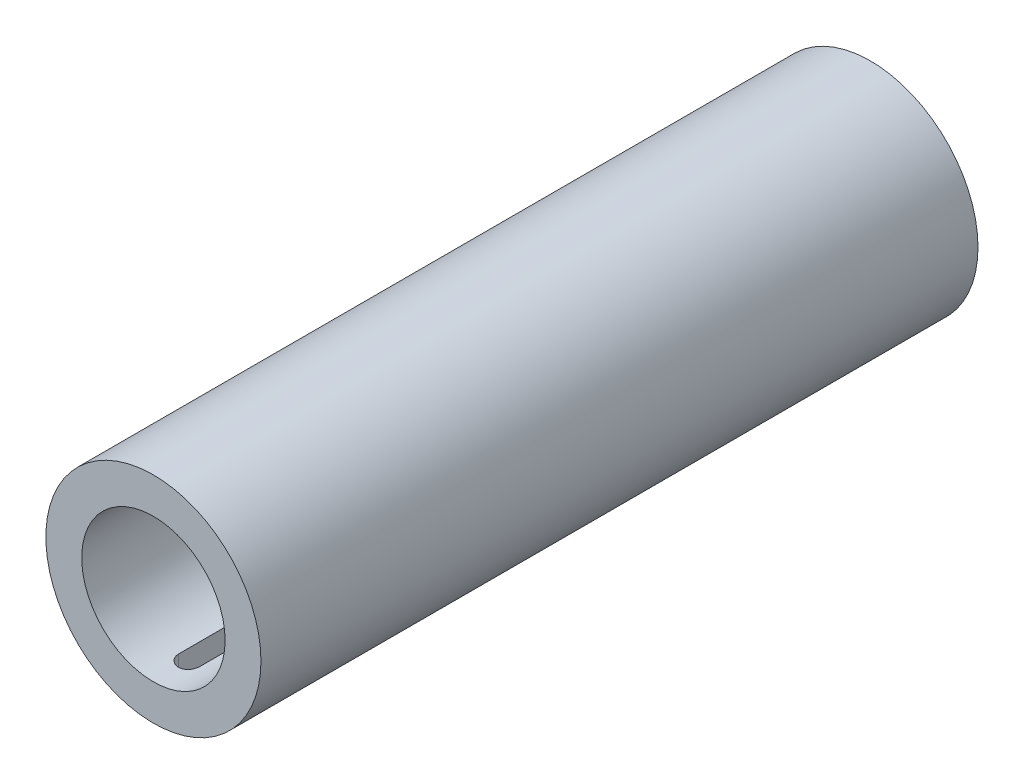
ISO-10303-21;
HEADER;
FILE_DESCRIPTION(('STEP AP214'),'2;1');
FILE_NAME('part.step','',(''),(''),'','','');
FILE_SCHEMA(('AUTOMOTIVE_DESIGN { 1 0 10303 214 1 1 1 1 }'));
ENDSEC;
DATA;
#1=APPLICATION_CONTEXT('core data for automotive mechanical design processes');
#2=APPLICATION_PROTOCOL_DEFINITION('international standard','automotive_design',2000,#1);
#3=PRODUCT_CONTEXT('',#1,'mechanical');
#4=PRODUCT('Part','Part','',(#3));
#5=PRODUCT_RELATED_PRODUCT_CATEGORY('part','',(#4));
#6=PRODUCT_DEFINITION_FORMATION('','',#4);
#7=PRODUCT_DEFINITION_CONTEXT('part definition',#1,'design');
#8=PRODUCT_DEFINITION('design','',#6,#7);
#9=PRODUCT_DEFINITION_SHAPE('','',#8);
#10=(LENGTH_UNIT() NAMED_UNIT(*) SI_UNIT(.MILLI.,.METRE.));
#11=(NAMED_UNIT(*) PLANE_ANGLE_UNIT() SI_UNIT($,.RADIAN.));
#12=(NAMED_UNIT(*) SI_UNIT($,.STERADIAN.) SOLID_ANGLE_UNIT());
#13=UNCERTAINTY_MEASURE_WITH_UNIT(LENGTH_MEASURE(1.E-05),#10,'distance_accuracy_value','');
#14=(GEOMETRIC_REPRESENTATION_CONTEXT(3) GLOBAL_UNCERTAINTY_ASSIGNED_CONTEXT((#13)) GLOBAL_UNIT_ASSIGNED_CONTEXT((#10,
#11,#12)) REPRESENTATION_CONTEXT('',''));
#15=CARTESIAN_POINT('',(0.,0.,0.));
#16=DIRECTION('',(0.,0.,1.));
#17=DIRECTION('',(1.,0.,0.));
#18=AXIS2_PLACEMENT_3D('',#15,#16,#17);
#19=CARTESIAN_POINT('',(0.,0.,100.));
#20=DIRECTION('',(0.,0.,1.));
#21=DIRECTION('',(1.,0.,0.));
#22=AXIS2_PLACEMENT_3D('',#19,#20,#21);
#23=PLANE('',#22);
#24=CARTESIAN_POINT('',(0.,0.,100.));
#25=DIRECTION('',(0.,0.,1.));
#26=DIRECTION('',(1.,0.,0.));
#27=AXIS2_PLACEMENT_3D('',#24,#25,#26);
#28=CIRCLE('',#27,15.);
#29=CARTESIAN_POINT('',(15.,0.,100.));
#30=VERTEX_POINT('',#29);
#31=EDGE_CURVE('E192',#30,#30,#28,.T.);
#32=ORIENTED_EDGE('',*,*,#31,.T.);
#33=EDGE_LOOP('',(#32));
#34=FACE_BOUND('',#33,.T.);
#35=CARTESIAN_POINT('',(0.,0.,100.));
#36=DIRECTION('',(0.,0.,1.));
#37=DIRECTION('',(1.,0.,0.));
#38=AXIS2_PLACEMENT_3D('',#35,#36,#37);
#39=CIRCLE('',#38,10.);
#40=CARTESIAN_POINT('',(10.,0.,100.));
#41=VERTEX_POINT('',#40);
#42=EDGE_CURVE('E183',#41,#41,#39,.T.);
#43=ORIENTED_EDGE('',*,*,#42,.F.);
#44=EDGE_LOOP('',(#43));
#45=FACE_BOUND('',#44,.T.);
#46=ADVANCED_FACE('F41',(#34,#45),#23,.T.);
#47=CARTESIAN_POINT('',(0.,0.,0.));
#48=DIRECTION('',(0.,0.,1.));
#49=DIRECTION('',(1.,0.,0.));
#50=AXIS2_PLACEMENT_3D('',#47,#48,#49);
#51=PLANE('',#50);
#52=DIRECTION('',(1.,0.,0.));
#53=VECTOR('',#52,1.);
#54=CARTESIAN_POINT('',(1.57769424203311,-11.,0.));
#55=LINE('',#54,#53);
#56=CARTESIAN_POINT('',(-1.57769424203311,-11.,0.));
#57=VERTEX_POINT('',#56);
#58=CARTESIAN_POINT('',(1.57769424203311,-11.,0.));
#59=VERTEX_POINT('',#58);
#60=EDGE_CURVE('E174',#57,#59,#55,.T.);
#61=ORIENTED_EDGE('',*,*,#60,.F.);
#62=DIRECTION('',(-0.5,0.866025403784439,0.));
#63=VECTOR('',#62,1.);
#64=CARTESIAN_POINT('',(-1.57769424203311,-11.,0.));
#65=LINE('',#64,#63);
#66=CARTESIAN_POINT('',(0.,-13.7326465860102,0.));
#67=VERTEX_POINT('',#66);
#68=EDGE_CURVE('E114',#67,#57,#65,.T.);
#69=ORIENTED_EDGE('',*,*,#68,.F.);
#70=DIRECTION('',(-0.5,-0.866025403784439,0.));
#71=VECTOR('',#70,1.);
#72=CARTESIAN_POINT('',(0.,-13.7326465860102,0.));
#73=LINE('',#72,#71);
#74=EDGE_CURVE('E226',#59,#67,#73,.T.);
#75=ORIENTED_EDGE('',*,*,#74,.F.);
#76=EDGE_LOOP('',(#61,#69,#75));
#77=FACE_BOUND('',#76,.T.);
#78=CARTESIAN_POINT('',(0.,0.,0.));
#79=DIRECTION('',(0.,0.,1.));
#80=DIRECTION('',(1.,0.,0.));
#81=AXIS2_PLACEMENT_3D('',#78,#79,#80);
#82=CIRCLE('',#81,15.);
#83=CARTESIAN_POINT('',(15.,0.,0.));
#84=VERTEX_POINT('',#83);
#85=EDGE_CURVE('E178',#84,#84,#82,.T.);
#86=ORIENTED_EDGE('',*,*,#85,.F.);
#87=EDGE_LOOP('',(#86));
#88=FACE_BOUND('',#87,.T.);
#89=CARTESIAN_POINT('',(0.,0.,0.));
#90=DIRECTION('',(0.,0.,1.));
#91=DIRECTION('',(1.,0.,0.));
#92=AXIS2_PLACEMENT_3D('',#89,#90,#91);
#93=CIRCLE('',#92,10.);
#94=CARTESIAN_POINT('',(10.,0.,0.));
#95=VERTEX_POINT('',#94);
#96=EDGE_CURVE('E181',#95,#95,#93,.T.);
#97=ORIENTED_EDGE('',*,*,#96,.T.);
#98=EDGE_LOOP('',(#97));
#99=FACE_BOUND('',#98,.T.);
#100=ADVANCED_FACE('F161',(#77,#88,#99),#51,.F.);
#101=CARTESIAN_POINT('',(0.,0.,100.));
#102=DIRECTION('',(0.,0.,-1.));
#103=DIRECTION('',(-1.,0.,0.));
#104=AXIS2_PLACEMENT_3D('',#101,#102,#103);
#105=CYLINDRICAL_SURFACE('',#104,15.);
#106=DIRECTION('',(0.,0.,-1.));
#107=VECTOR('',#106,1.);
#108=CARTESIAN_POINT('',(-1.5,-14.9248115565993,100.));
#109=LINE('',#108,#107);
#110=CARTESIAN_POINT('',(-1.5,-14.9248115565993,20.));
#111=VERTEX_POINT('',#110);
#112=CARTESIAN_POINT('',(-1.5,-14.9248115565993,95.));
#113=VERTEX_POINT('',#112);
#114=EDGE_CURVE('E108',#111,#113,#109,.F.);
#115=ORIENTED_EDGE('',*,*,#114,.T.);
#116=CARTESIAN_POINT('',(-1.5,-14.9248115565993,95.));
#117=CARTESIAN_POINT('',(-1.49999984550738,-14.9248105405652,95.0420888520983));
#118=CARTESIAN_POINT('',(-1.49822741440047,-14.9249898231295,95.084157436979));
#119=CARTESIAN_POINT('',(-1.49115728926902,-14.9256982610156,95.1679915135174));
#120=CARTESIAN_POINT('',(-1.48585982951031,-14.9262273930872,95.2097570251304));
#121=CARTESIAN_POINT('',(-1.46473386877576,-14.9283210001532,95.3340642077011));
#122=CARTESIAN_POINT('',(-1.44367162502198,-14.9303917616669,95.4157699236219));
#123=CARTESIAN_POINT('',(-1.38819060592267,-14.9356517710427,95.5744605109782));
#124=CARTESIAN_POINT('',(-1.35376680096843,-14.9388414400445,95.65144359205));
#125=CARTESIAN_POINT('',(-1.27255023718886,-14.9459784325361,95.7985422065466));
#126=CARTESIAN_POINT('',(-1.22575896870337,-14.9499256647202,95.8686585660505));
#127=CARTESIAN_POINT('',(-1.12095989168653,-14.9581486725595,96.000274463546));
#128=CARTESIAN_POINT('',(-1.06291731381802,-14.962425441222,96.0617462444893));
#129=CARTESIAN_POINT('',(-0.937329794826621,-14.9708171412676,96.1741006877466));
#130=CARTESIAN_POINT('',(-0.869783409359444,-14.9749320479297,96.2249817376113));
#131=CARTESIAN_POINT('',(-0.726937376238593,-14.9825458619702,96.3147983242583));
#132=CARTESIAN_POINT('',(-0.651621939828397,-14.9860434741472,96.3537088687447));
#133=CARTESIAN_POINT('',(-0.495490096453528,-14.9920174034256,96.4183181831312));
#134=CARTESIAN_POINT('',(-0.414674155302865,-14.9944938068837,96.4440180702124));
#135=CARTESIAN_POINT('',(-0.250118182972205,-14.9981394760791,96.4813966400431));
#136=CARTESIAN_POINT('',(-0.166388844193089,-14.9993130891162,96.4931219644158));
#137=CARTESIAN_POINT('',(0.00185903992906527,-15.0002357398837,96.502362961854));
#138=CARTESIAN_POINT('',(0.0863775840874468,-14.9999847797523,96.4998786562459));
#139=CARTESIAN_POINT('',(0.253483476941733,-14.9980900673199,96.480808269245));
#140=CARTESIAN_POINT('',(0.336076660363391,-14.9964513089226,96.4642727495197));
#141=CARTESIAN_POINT('',(0.497309163588857,-14.99197092482,96.4176481495405));
#142=CARTESIAN_POINT('',(0.575948451814888,-14.9891292895097,96.3875589610595));
#143=CARTESIAN_POINT('',(0.727202160756062,-14.9825539885859,96.3146250637809));
#144=CARTESIAN_POINT('',(0.799805598266283,-14.9788187427939,96.271757725872));
#145=CARTESIAN_POINT('',(0.936803159978407,-14.9708755799474,96.1745026896983));
#146=CARTESIAN_POINT('',(1.00119740952327,-14.9666676701117,96.1201151673644));
#147=CARTESIAN_POINT('',(1.12024011579595,-14.9582300399733,96.0010880188028));
#148=CARTESIAN_POINT('',(1.17484602298743,-14.9540003029365,95.9364058350899));
#149=CARTESIAN_POINT('',(1.2724482975244,-14.9460122474671,95.7987456015797));
#150=CARTESIAN_POINT('',(1.31544113382606,-14.942254072602,95.725765038159));
#151=CARTESIAN_POINT('',(1.38859533887637,-14.9356338508136,95.5735373774721));
#152=CARTESIAN_POINT('',(1.41874636545733,-14.9327725266579,95.4942852901006));
#153=CARTESIAN_POINT('',(1.4652563657267,-14.9282811773481,95.3318674206297));
#154=CARTESIAN_POINT('',(1.48163620279748,-14.9266492899856,95.2487077610874));
#155=CARTESIAN_POINT('',(1.49394303375407,-14.9254191773912,95.1374716507815));
#156=CARTESIAN_POINT('',(1.49621552314765,-14.9251914639091,95.1100026005142));
#157=CARTESIAN_POINT('',(1.49924195609436,-14.9248878407684,95.0550261844969));
#158=CARTESIAN_POINT('',(1.49999843343703,-14.9248116778171,95.0275189597002));
#159=CARTESIAN_POINT('',(1.5,-14.9248115565993,95.));
#160=B_SPLINE_CURVE_WITH_KNOTS('',3,(#116,#117,#118,#119,#120,#121,#122,#123,#124,#125,#126,
#127,#128,#129,#130,#131,#132,#133,#134,#135,#136,#137,#138,#139,#140,#141,#142,#143,#144,#145,
#146,#147,#148,#149,#150,#151,#152,#153,#154,#155,#156,#157,#158,#159),.UNSPECIFIED.,.F.,.F.,(4,
2,2,2,2,2,2,2,2,2,2,2,2,2,2,2,2,2,2,2,2,4),(0.,0.126188669953261,0.252368954516711,
0.504275212197885,0.756276385475112,1.00824720521265,1.26100946118738,1.51381017236425,
1.76713515973781,2.02043872074009,2.27289446461177,2.52534982958904,2.77690059136096,
3.02845336182359,3.28045428641837,3.53245136284618,3.78551861392433,4.03866272565792,
4.29201032358889,4.54497340414717,4.62763460025912,4.7101575248208),.UNSPECIFIED.);
#161=CARTESIAN_POINT('',(1.5,-14.9248115565993,95.));
#162=VERTEX_POINT('',#161);
#163=EDGE_CURVE('E117',#113,#162,#160,.T.);
#164=ORIENTED_EDGE('',*,*,#163,.T.);
#165=DIRECTION('',(0.,0.,-1.));
#166=VECTOR('',#165,1.);
#167=CARTESIAN_POINT('',(1.5,-14.9248115565993,100.));
#168=LINE('',#167,#166);
#169=CARTESIAN_POINT('',(1.5,-14.9248115565993,20.));
#170=VERTEX_POINT('',#169);
#171=EDGE_CURVE('E110',#162,#170,#168,.T.);
#172=ORIENTED_EDGE('',*,*,#171,.T.);
#173=CARTESIAN_POINT('',(1.5,-14.9248115565993,20.));
#174=CARTESIAN_POINT('',(1.49999984550738,-14.9248105405652,19.9579111479017));
#175=CARTESIAN_POINT('',(1.49822741440047,-14.9249898231295,19.915842563021));
#176=CARTESIAN_POINT('',(1.49115728926902,-14.9256982610156,19.8320084864826));
#177=CARTESIAN_POINT('',(1.48585982951031,-14.9262273930872,19.7902429748696));
#178=CARTESIAN_POINT('',(1.46473386877575,-14.9283210001532,19.6659357922989));
#179=CARTESIAN_POINT('',(1.44367162502198,-14.9303917616669,19.5842300763781));
#180=CARTESIAN_POINT('',(1.38819060592266,-14.9356517710427,19.4255394890218));
#181=CARTESIAN_POINT('',(1.35376680096842,-14.9388414400445,19.34855640795));
#182=CARTESIAN_POINT('',(1.27255023718886,-14.9459784325361,19.2014577934534));
#183=CARTESIAN_POINT('',(1.22575896870337,-14.9499256647202,19.1313414339495));
#184=CARTESIAN_POINT('',(1.12095989168653,-14.9581486725595,18.999725536454));
#185=CARTESIAN_POINT('',(1.06291731381802,-14.962425441222,18.9382537555107));
#186=CARTESIAN_POINT('',(0.937329794826616,-14.9708171412676,18.8258993122534));
#187=CARTESIAN_POINT('',(0.869783409359437,-14.9749320479297,18.7750182623887));
#188=CARTESIAN_POINT('',(0.726937376238586,-14.9825458619702,18.6852016757417));
#189=CARTESIAN_POINT('',(0.651621939828393,-14.9860434741472,18.6462911312553));
#190=CARTESIAN_POINT('',(0.495490096453525,-14.9920174034256,18.5816818168688));
#191=CARTESIAN_POINT('',(0.41467415530286,-14.9944938068837,18.5559819297876));
#192=CARTESIAN_POINT('',(0.250118182972199,-14.9981394760791,18.5186033599569));
#193=CARTESIAN_POINT('',(0.166388844193084,-14.9993130891162,18.5068780355842));
#194=CARTESIAN_POINT('',(-0.00185903992907218,-15.0002357398837,18.497637038146));
#195=CARTESIAN_POINT('',(-0.0863775840874553,-14.9999847797523,18.5001213437541));
#196=CARTESIAN_POINT('',(-0.253483476941741,-14.9980900673199,18.519191730755));
#197=CARTESIAN_POINT('',(-0.336076660363396,-14.9964513089226,18.5357272504803));
#198=CARTESIAN_POINT('',(-0.497309163588862,-14.99197092482,18.5823518504595));
#199=CARTESIAN_POINT('',(-0.575948451814895,-14.9891292895097,18.6124410389405));
#200=CARTESIAN_POINT('',(-0.727202160756066,-14.9825539885859,18.6853749362191));
#201=CARTESIAN_POINT('',(-0.799805598266282,-14.9788187427939,18.728242274128));
#202=CARTESIAN_POINT('',(-0.936803159978405,-14.9708755799474,18.8254973103017));
#203=CARTESIAN_POINT('',(-1.00119740952327,-14.9666676701117,18.8798848326356));
#204=CARTESIAN_POINT('',(-1.12024011579595,-14.9582300399733,18.9989119811972));
#205=CARTESIAN_POINT('',(-1.17484602298743,-14.9540003029365,19.0635941649101));
#206=CARTESIAN_POINT('',(-1.2724482975244,-14.9460122474671,19.2012543984203));
#207=CARTESIAN_POINT('',(-1.31544113382607,-14.942254072602,19.274234961841));
#208=CARTESIAN_POINT('',(-1.38859533887637,-14.9356338508136,19.4264626225279));
#209=CARTESIAN_POINT('',(-1.41874636545733,-14.9327725266579,19.5057147098994));
#210=CARTESIAN_POINT('',(-1.4652563657267,-14.9282811773481,19.6681325793703));
#211=CARTESIAN_POINT('',(-1.48163620279749,-14.9266492899856,19.7512922389126));
#212=CARTESIAN_POINT('',(-1.49394303375407,-14.9254191773912,19.8625283492185));
#213=CARTESIAN_POINT('',(-1.49621552314766,-14.9251914639091,19.8899973994859));
#214=CARTESIAN_POINT('',(-1.49924195609436,-14.9248878407684,19.9449738155032));
#215=CARTESIAN_POINT('',(-1.49999843343703,-14.9248116778171,19.9724810402998));
#216=CARTESIAN_POINT('',(-1.5,-14.9248115565993,20.));
#217=B_SPLINE_CURVE_WITH_KNOTS('',3,(#173,#174,#175,#176,#177,#178,#179,#180,#181,#182,#183,
#184,#185,#186,#187,#188,#189,#190,#191,#192,#193,#194,#195,#196,#197,#198,#199,#200,#201,#202,
#203,#204,#205,#206,#207,#208,#209,#210,#211,#212,#213,#214,#215,#216),.UNSPECIFIED.,.F.,.F.,(4,
2,2,2,2,2,2,2,2,2,2,2,2,2,2,2,2,2,2,2,2,4),(0.,0.126188669953261,0.252368954516705,
0.504275212197892,0.756276385475121,1.00824720521265,1.26100946118738,1.51381017236425,
1.76713515973781,2.02043872074009,2.27289446461177,2.52534982958905,2.77690059136096,
3.02845336182359,3.28045428641837,3.53245136284618,3.78551861392433,4.03866272565792,
4.29201032358889,4.54497340414718,4.62763460025914,4.7101575248208),.UNSPECIFIED.);
#218=EDGE_CURVE('E106',#170,#111,#217,.T.);
#219=ORIENTED_EDGE('',*,*,#218,.T.);
#220=EDGE_LOOP('',(#115,#164,#172,#219));
#221=FACE_BOUND('',#220,.T.);
#222=ORIENTED_EDGE('',*,*,#31,.F.);
#223=EDGE_LOOP('',(#222));
#224=FACE_BOUND('',#223,.T.);
#225=ORIENTED_EDGE('',*,*,#85,.T.);
#226=EDGE_LOOP('',(#225));
#227=FACE_BOUND('',#226,.T.);
#228=ADVANCED_FACE('F43',(#221,#224,#227),#105,.T.);
#229=CARTESIAN_POINT('',(0.,0.,100.));
#230=DIRECTION('',(0.,0.,-1.));
#231=DIRECTION('',(-1.,0.,0.));
#232=AXIS2_PLACEMENT_3D('',#229,#230,#231);
#233=CYLINDRICAL_SURFACE('',#232,10.);
#234=CARTESIAN_POINT('',(1.5,-9.88685996664259,20.));
#235=CARTESIAN_POINT('',(1.50000000266732,-9.88685840785077,19.9580518202284));
#236=CARTESIAN_POINT('',(1.49823923973863,-9.88712727473813,19.9161239716696));
#237=CARTESIAN_POINT('',(1.49121669464497,-9.88818949187884,19.8325729919536));
#238=CARTESIAN_POINT('',(1.48595522764718,-9.88898279491733,19.7909498337063));
#239=CARTESIAN_POINT('',(1.46497881750098,-9.89212058297808,19.6670918819678));
#240=CARTESIAN_POINT('',(1.44407166865904,-9.89522307907874,19.5856941728406));
#241=CARTESIAN_POINT('',(1.38902615352525,-9.90309898933595,19.4276160400256));
#242=CARTESIAN_POINT('',(1.35488426140282,-9.90787284872281,19.3509368797062));
#243=CARTESIAN_POINT('',(1.27435597412008,-9.91855133175475,19.2043846840671));
#244=CARTESIAN_POINT('',(1.22796990236328,-9.92445592553278,19.1345114690497));
#245=CARTESIAN_POINT('',(1.12388153164428,-9.93678257695107,19.003018343427));
#246=CARTESIAN_POINT('',(1.06610171081972,-9.94320799119173,18.9414601330534));
#247=CARTESIAN_POINT('',(0.941026215278604,-9.95582307783248,18.8288678084724));
#248=CARTESIAN_POINT('',(0.873729088931482,-9.9620127140873,18.7778353026265));
#249=CARTESIAN_POINT('',(0.731134276552847,-9.97349364061962,18.6875219740596));
#250=CARTESIAN_POINT('',(0.655799848412228,-9.9787804905557,18.6482985520619));
#251=CARTESIAN_POINT('',(0.499524151714074,-9.98782228654626,18.5830869108457));
#252=CARTESIAN_POINT('',(0.418583504853573,-9.991577402144,18.5570972267437));
#253=CARTESIAN_POINT('',(0.254032109539508,-9.99710911461993,18.5192768330848));
#254=CARTESIAN_POINT('',(0.170445893373183,-9.99890031620178,18.5073415576171));
#255=CARTESIAN_POINT('',(0.00243723131435105,-10.0003524554738,18.4976440141637));
#256=CARTESIAN_POINT('',(-0.0819851880217103,-10.0000134606003,18.4998812975124));
#257=CARTESIAN_POINT('',(-0.248551967983507,-9.99725499253034,18.5183833632824));
#258=CARTESIAN_POINT('',(-0.330709184196646,-9.99485226193999,18.5345352628208));
#259=CARTESIAN_POINT('',(-0.491133297591266,-9.98825497732616,18.5802307890995));
#260=CARTESIAN_POINT('',(-0.56940011783708,-9.98406038788298,18.6097746805602));
#261=CARTESIAN_POINT('',(-0.720165267893389,-9.97432184229562,18.6815316823409));
#262=CARTESIAN_POINT('',(-0.79264052820752,-9.96877281518181,18.7237925463523));
#263=CARTESIAN_POINT('',(-0.929510459057297,-9.95694413507246,18.8197474036781));
#264=CARTESIAN_POINT('',(-0.993904915673111,-9.95066446274332,18.8734416995637));
#265=CARTESIAN_POINT('',(-1.11344594750422,-9.93800248160563,18.9913597147132));
#266=CARTESIAN_POINT('',(-1.16849664126589,-9.93161976829432,19.0556806240439));
#267=CARTESIAN_POINT('',(-1.26705366225889,-9.9195286802005,19.1927216143761));
#268=CARTESIAN_POINT('',(-1.31055664285508,-9.91382050116966,19.2654441214946));
#269=CARTESIAN_POINT('',(-1.38479611633514,-9.90372408744827,19.41733398012));
#270=CARTESIAN_POINT('',(-1.41551523132484,-9.89933765170366,19.4965099305947));
#271=CARTESIAN_POINT('',(-1.46314856731708,-9.89241049501753,19.6589222567288));
#272=CARTESIAN_POINT('',(-1.48008348376203,-9.88986700772656,19.7421523456687));
#273=CARTESIAN_POINT('',(-1.49326003326035,-9.88788045186338,19.8550006632408));
#274=CARTESIAN_POINT('',(-1.49578864223619,-9.88749808040955,19.8839672253027));
#275=CARTESIAN_POINT('',(-1.49915639690531,-9.88698811323233,19.9419516924164));
#276=CARTESIAN_POINT('',(-1.49999838230593,-9.88686008927622,19.9709694287001));
#277=CARTESIAN_POINT('',(-1.5,-9.88685996664259,20.));
#278=B_SPLINE_CURVE_WITH_KNOTS('',3,(#234,#235,#236,#237,#238,#239,#240,#241,#242,#243,#244,
#245,#246,#247,#248,#249,#250,#251,#252,#253,#254,#255,#256,#257,#258,#259,#260,#261,#262,#263,
#264,#265,#266,#267,#268,#269,#270,#271,#272,#273,#274,#275,#276,#277),.UNSPECIFIED.,.F.,.F.,(4,
2,2,2,2,2,2,2,2,2,2,2,2,2,2,2,2,2,2,2,2,4),(0.,0.125766490239527,0.251521659296977,
0.502515401757197,0.753576056756899,1.00463008119644,1.25745516590775,1.51031885453268,
1.76439250557207,2.01843802629312,2.27058124023081,2.52271647202458,2.77282530444896,
3.02293908100775,3.27400403904697,3.52507564202535,3.77858546479491,4.03216867706422,
4.28609548338277,4.53964033991603,4.62684087345504,4.7138944667809),.UNSPECIFIED.);
#279=CARTESIAN_POINT('',(1.5,-9.88685996664259,20.));
#280=VERTEX_POINT('',#279);
#281=CARTESIAN_POINT('',(-1.5,-9.88685996664259,20.));
#282=VERTEX_POINT('',#281);
#283=EDGE_CURVE('E11',#280,#282,#278,.T.);
#284=ORIENTED_EDGE('',*,*,#283,.F.);
#285=DIRECTION('',(0.,0.,-1.));
#286=VECTOR('',#285,1.);
#287=CARTESIAN_POINT('',(1.5,-9.88685996664259,100.));
#288=LINE('',#287,#286);
#289=CARTESIAN_POINT('',(1.5,-9.88685996664259,95.));
#290=VERTEX_POINT('',#289);
#291=EDGE_CURVE('E56',#290,#280,#288,.T.);
#292=ORIENTED_EDGE('',*,*,#291,.F.);
#293=CARTESIAN_POINT('',(-1.5,-9.88685996664259,95.));
#294=CARTESIAN_POINT('',(-1.50000000266732,-9.88685840785077,95.0419481797716));
#295=CARTESIAN_POINT('',(-1.49823923973863,-9.88712727473813,95.0838760283304));
#296=CARTESIAN_POINT('',(-1.49121669464497,-9.88818949187884,95.1674270080464));
#297=CARTESIAN_POINT('',(-1.48595522764718,-9.88898279491733,95.2090501662937));
#298=CARTESIAN_POINT('',(-1.46497881750098,-9.89212058297808,95.3329081180322));
#299=CARTESIAN_POINT('',(-1.44407166865905,-9.89522307907874,95.4143058271594));
#300=CARTESIAN_POINT('',(-1.38902615352525,-9.90309898933595,95.5723839599744));
#301=CARTESIAN_POINT('',(-1.35488426140282,-9.90787284872282,95.6490631202938));
#302=CARTESIAN_POINT('',(-1.27435597412008,-9.91855133175475,95.7956153159329));
#303=CARTESIAN_POINT('',(-1.22796990236328,-9.92445592553278,95.8654885309503));
#304=CARTESIAN_POINT('',(-1.12388153164428,-9.93678257695107,95.996981656573));
#305=CARTESIAN_POINT('',(-1.06610171081972,-9.94320799119173,96.0585398669466));
#306=CARTESIAN_POINT('',(-0.941026215278609,-9.95582307783248,96.1711321915276));
#307=CARTESIAN_POINT('',(-0.873729088931483,-9.9620127140873,96.2221646973735));
#308=CARTESIAN_POINT('',(-0.731134276552846,-9.97349364061962,96.3124780259404));
#309=CARTESIAN_POINT('',(-0.655799848412227,-9.9787804905557,96.3517014479381));
#310=CARTESIAN_POINT('',(-0.499524151714072,-9.98782228654626,96.4169130891543));
#311=CARTESIAN_POINT('',(-0.418583504853571,-9.991577402144,96.4429027732563));
#312=CARTESIAN_POINT('',(-0.254032109539506,-9.99710911461993,96.4807231669152));
#313=CARTESIAN_POINT('',(-0.170445893373181,-9.99890031620178,96.4926584423829));
#314=CARTESIAN_POINT('',(-0.00243723131434989,-10.0003524554738,96.5023559858364));
#315=CARTESIAN_POINT('',(0.0819851880217116,-10.0000134606003,96.5001187024876));
#316=CARTESIAN_POINT('',(0.248551967983509,-9.99725499253034,96.4816166367175));
#317=CARTESIAN_POINT('',(0.330709184196647,-9.99485226193999,96.4654647371792));
#318=CARTESIAN_POINT('',(0.491133297591267,-9.98825497732616,96.4197692109005));
#319=CARTESIAN_POINT('',(0.569400117837082,-9.98406038788298,96.3902253194398));
#320=CARTESIAN_POINT('',(0.720165267893391,-9.97432184229562,96.3184683176591));
#321=CARTESIAN_POINT('',(0.79264052820752,-9.96877281518181,96.2762074536477));
#322=CARTESIAN_POINT('',(0.929510459057296,-9.95694413507246,96.1802525963219));
#323=CARTESIAN_POINT('',(0.99390491567311,-9.95066446274332,96.1265583004363));
#324=CARTESIAN_POINT('',(1.11344594750422,-9.93800248160563,96.0086402852868));
#325=CARTESIAN_POINT('',(1.16849664126589,-9.93161976829432,95.9443193759561));
#326=CARTESIAN_POINT('',(1.26705366225889,-9.9195286802005,95.8072783856238));
#327=CARTESIAN_POINT('',(1.31055664285509,-9.91382050116966,95.7345558785054));
#328=CARTESIAN_POINT('',(1.38479611633514,-9.90372408744827,95.58266601988));
#329=CARTESIAN_POINT('',(1.41551523132483,-9.89933765170366,95.5034900694053));
#330=CARTESIAN_POINT('',(1.46314856731708,-9.89241049501753,95.3410777432712));
#331=CARTESIAN_POINT('',(1.48008348376203,-9.88986700772656,95.2578476543313));
#332=CARTESIAN_POINT('',(1.49326003326035,-9.88788045186338,95.1449993367592));
#333=CARTESIAN_POINT('',(1.49578864223618,-9.88749808040955,95.1160327746973));
#334=CARTESIAN_POINT('',(1.49915639690531,-9.88698811323233,95.0580483075836));
#335=CARTESIAN_POINT('',(1.49999838230593,-9.88686008927622,95.0290305712999));
#336=CARTESIAN_POINT('',(1.5,-9.88685996664259,95.));
#337=B_SPLINE_CURVE_WITH_KNOTS('',3,(#293,#294,#295,#296,#297,#298,#299,#300,#301,#302,#303,
#304,#305,#306,#307,#308,#309,#310,#311,#312,#313,#314,#315,#316,#317,#318,#319,#320,#321,#322,
#323,#324,#325,#326,#327,#328,#329,#330,#331,#332,#333,#334,#335,#336),.UNSPECIFIED.,.F.,.F.,(4,
2,2,2,2,2,2,2,2,2,2,2,2,2,2,2,2,2,2,2,2,4),(0.,0.125766490239516,0.251521659296963,
0.502515401757197,0.753576056756896,1.00463008119643,1.25745516590774,1.51031885453268,
1.76439250557207,2.01843802629312,2.27058124023081,2.52271647202459,2.77282530444897,
3.02293908100775,3.27400403904697,3.52507564202536,3.77858546479491,4.03216867706424,
4.28609548338274,4.53964033991602,4.62684087345504,4.71389446678091),.UNSPECIFIED.);
#338=CARTESIAN_POINT('',(-1.5,-9.88685996664259,95.));
#339=VERTEX_POINT('',#338);
#340=EDGE_CURVE('E143',#339,#290,#337,.T.);
#341=ORIENTED_EDGE('',*,*,#340,.F.);
#342=DIRECTION('',(0.,0.,-1.));
#343=VECTOR('',#342,1.);
#344=CARTESIAN_POINT('',(-1.5,-9.88685996664259,100.));
#345=LINE('',#344,#343);
#346=EDGE_CURVE('E149',#282,#339,#345,.F.);
#347=ORIENTED_EDGE('',*,*,#346,.F.);
#348=EDGE_LOOP('',(#284,#292,#341,#347));
#349=FACE_BOUND('',#348,.T.);
#350=ORIENTED_EDGE('',*,*,#42,.T.);
#351=EDGE_LOOP('',(#350));
#352=FACE_BOUND('',#351,.T.);
#353=ORIENTED_EDGE('',*,*,#96,.F.);
#354=EDGE_LOOP('',(#353));
#355=FACE_BOUND('',#354,.T.);
#356=ADVANCED_FACE('F151',(#349,#352,#355),#233,.F.);
#357=CARTESIAN_POINT('',(-1.57769424203311,-11.,1.));
#358=DIRECTION('',(-0.866025403784439,-0.5,0.));
#359=DIRECTION('',(0.5,-0.866025403784439,0.));
#360=AXIS2_PLACEMENT_3D('',#357,#358,#359);
#361=PLANE('',#360);
#362=ORIENTED_EDGE('',*,*,#68,.T.);
#363=DIRECTION('',(0.,0.,-1.));
#364=VECTOR('',#363,1.);
#365=CARTESIAN_POINT('',(-1.57769424203311,-11.,1.));
#366=LINE('',#365,#364);
#367=CARTESIAN_POINT('',(-1.57769424203311,-11.,1.));
#368=VERTEX_POINT('',#367);
#369=EDGE_CURVE('E232',#368,#57,#366,.T.);
#370=ORIENTED_EDGE('',*,*,#369,.F.);
#371=DIRECTION('',(-0.5,0.866025403784439,0.));
#372=VECTOR('',#371,1.);
#373=CARTESIAN_POINT('',(-1.57769424203311,-11.,1.));
#374=LINE('',#373,#372);
#375=CARTESIAN_POINT('',(0.,-13.7326465860102,1.));
#376=VERTEX_POINT('',#375);
#377=EDGE_CURVE('E222',#376,#368,#374,.T.);
#378=ORIENTED_EDGE('',*,*,#377,.F.);
#379=DIRECTION('',(0.,0.,-1.));
#380=VECTOR('',#379,1.);
#381=CARTESIAN_POINT('',(0.,-13.7326465860102,1.));
#382=LINE('',#381,#380);
#383=EDGE_CURVE('E184',#376,#67,#382,.T.);
#384=ORIENTED_EDGE('',*,*,#383,.T.);
#385=EDGE_LOOP('',(#362,#370,#378,#384));
#386=FACE_BOUND('',#385,.T.);
#387=ADVANCED_FACE('F156',(#386),#361,.F.);
#388=CARTESIAN_POINT('',(0.,-13.7326465860102,1.));
#389=DIRECTION('',(0.866025403784439,-0.5,0.));
#390=DIRECTION('',(0.5,0.866025403784439,0.));
#391=AXIS2_PLACEMENT_3D('',#388,#389,#390);
#392=PLANE('',#391);
#393=ORIENTED_EDGE('',*,*,#74,.T.);
#394=ORIENTED_EDGE('',*,*,#383,.F.);
#395=DIRECTION('',(-0.5,-0.866025403784439,0.));
#396=VECTOR('',#395,1.);
#397=CARTESIAN_POINT('',(0.,-13.7326465860102,1.));
#398=LINE('',#397,#396);
#399=CARTESIAN_POINT('',(1.57769424203311,-11.,1.));
#400=VERTEX_POINT('',#399);
#401=EDGE_CURVE('E229',#400,#376,#398,.T.);
#402=ORIENTED_EDGE('',*,*,#401,.F.);
#403=DIRECTION('',(0.,0.,-1.));
#404=VECTOR('',#403,1.);
#405=CARTESIAN_POINT('',(1.57769424203311,-11.,1.));
#406=LINE('',#405,#404);
#407=EDGE_CURVE('E188',#400,#59,#406,.T.);
#408=ORIENTED_EDGE('',*,*,#407,.T.);
#409=EDGE_LOOP('',(#393,#394,#402,#408));
#410=FACE_BOUND('',#409,.T.);
#411=ADVANCED_FACE('F243',(#410),#392,.F.);
#412=CARTESIAN_POINT('',(1.57769424203311,-11.,1.));
#413=DIRECTION('',(0.,1.,0.));
#414=DIRECTION('',(0.,0.,1.));
#415=AXIS2_PLACEMENT_3D('',#412,#413,#414);
#416=PLANE('',#415);
#417=ORIENTED_EDGE('',*,*,#60,.T.);
#418=ORIENTED_EDGE('',*,*,#407,.F.);
#419=DIRECTION('',(1.,0.,0.));
#420=VECTOR('',#419,1.);
#421=CARTESIAN_POINT('',(1.57769424203311,-11.,1.));
#422=LINE('',#421,#420);
#423=EDGE_CURVE('E225',#368,#400,#422,.T.);
#424=ORIENTED_EDGE('',*,*,#423,.F.);
#425=ORIENTED_EDGE('',*,*,#369,.T.);
#426=EDGE_LOOP('',(#417,#418,#424,#425));
#427=FACE_BOUND('',#426,.T.);
#428=ADVANCED_FACE('F211',(#427),#416,.F.);
#429=CARTESIAN_POINT('',(0.,0.,1.));
#430=DIRECTION('',(0.,0.,1.));
#431=DIRECTION('',(1.,0.,0.));
#432=AXIS2_PLACEMENT_3D('',#429,#430,#431);
#433=PLANE('',#432);
#434=ORIENTED_EDGE('',*,*,#377,.T.);
#435=ORIENTED_EDGE('',*,*,#423,.T.);
#436=ORIENTED_EDGE('',*,*,#401,.T.);
#437=EDGE_LOOP('',(#434,#435,#436));
#438=FACE_BOUND('',#437,.T.);
#439=ADVANCED_FACE('F207',(#438),#433,.F.);
#440=CARTESIAN_POINT('',(0.,-15.,20.));
#441=DIRECTION('',(0.,1.,0.));
#442=DIRECTION('',(0.,0.,1.));
#443=AXIS2_PLACEMENT_3D('',#440,#441,#442);
#444=CYLINDRICAL_SURFACE('',#443,1.5);
#445=DIRECTION('',(0.,1.,0.));
#446=VECTOR('',#445,1.);
#447=CARTESIAN_POINT('',(1.5,-15.,20.));
#448=LINE('',#447,#446);
#449=EDGE_CURVE('E118',#170,#280,#448,.T.);
#450=ORIENTED_EDGE('',*,*,#449,.T.);
#451=ORIENTED_EDGE('',*,*,#283,.T.);
#452=DIRECTION('',(0.,1.,0.));
#453=VECTOR('',#452,1.);
#454=CARTESIAN_POINT('',(-1.5,-15.,20.));
#455=LINE('',#454,#453);
#456=EDGE_CURVE('E68',#111,#282,#455,.T.);
#457=ORIENTED_EDGE('',*,*,#456,.F.);
#458=ORIENTED_EDGE('',*,*,#218,.F.);
#459=EDGE_LOOP('',(#450,#451,#457,#458));
#460=FACE_BOUND('',#459,.T.);
#461=ADVANCED_FACE('F120',(#460),#444,.F.);
#462=CARTESIAN_POINT('',(1.5,-15.,20.));
#463=DIRECTION('',(1.,0.,0.));
#464=DIRECTION('',(0.,0.,-1.));
#465=AXIS2_PLACEMENT_3D('',#462,#463,#464);
#466=PLANE('',#465);
#467=DIRECTION('',(0.,1.,0.));
#468=VECTOR('',#467,1.);
#469=CARTESIAN_POINT('',(1.5,-15.,95.));
#470=LINE('',#469,#468);
#471=EDGE_CURVE('E124',#162,#290,#470,.T.);
#472=ORIENTED_EDGE('',*,*,#471,.T.);
#473=ORIENTED_EDGE('',*,*,#291,.T.);
#474=ORIENTED_EDGE('',*,*,#449,.F.);
#475=ORIENTED_EDGE('',*,*,#171,.F.);
#476=EDGE_LOOP('',(#472,#473,#474,#475));
#477=FACE_BOUND('',#476,.T.);
#478=ADVANCED_FACE('F139',(#477),#466,.F.);
#479=CARTESIAN_POINT('',(0.,-15.,95.));
#480=DIRECTION('',(0.,1.,0.));
#481=DIRECTION('',(0.,0.,1.));
#482=AXIS2_PLACEMENT_3D('',#479,#480,#481);
#483=CYLINDRICAL_SURFACE('',#482,1.5);
#484=DIRECTION('',(0.,1.,0.));
#485=VECTOR('',#484,1.);
#486=CARTESIAN_POINT('',(-1.5,-15.,95.));
#487=LINE('',#486,#485);
#488=EDGE_CURVE('E63',#113,#339,#487,.T.);
#489=ORIENTED_EDGE('',*,*,#488,.T.);
#490=ORIENTED_EDGE('',*,*,#340,.T.);
#491=ORIENTED_EDGE('',*,*,#471,.F.);
#492=ORIENTED_EDGE('',*,*,#163,.F.);
#493=EDGE_LOOP('',(#489,#490,#491,#492));
#494=FACE_BOUND('',#493,.T.);
#495=ADVANCED_FACE('F134',(#494),#483,.F.);
#496=CARTESIAN_POINT('',(-1.5,-15.,20.));
#497=DIRECTION('',(-1.,0.,0.));
#498=DIRECTION('',(0.,0.,1.));
#499=AXIS2_PLACEMENT_3D('',#496,#497,#498);
#500=PLANE('',#499);
#501=ORIENTED_EDGE('',*,*,#456,.T.);
#502=ORIENTED_EDGE('',*,*,#346,.T.);
#503=ORIENTED_EDGE('',*,*,#488,.F.);
#504=ORIENTED_EDGE('',*,*,#114,.F.);
#505=EDGE_LOOP('',(#501,#502,#503,#504));
#506=FACE_BOUND('',#505,.T.);
#507=ADVANCED_FACE('F116',(#506),#500,.F.);
#508=CLOSED_SHELL('',(#46,#100,#228,#356,#387,#411,#428,#439,#461,#478,#495,#507));
#509=MANIFOLD_SOLID_BREP('B2',#508);
#510=ADVANCED_BREP_SHAPE_REPRESENTATION('',(#18,#509),#14);
#511=SHAPE_DEFINITION_REPRESENTATION(#9,#510);
ENDSEC;
END-ISO-10303-21;
